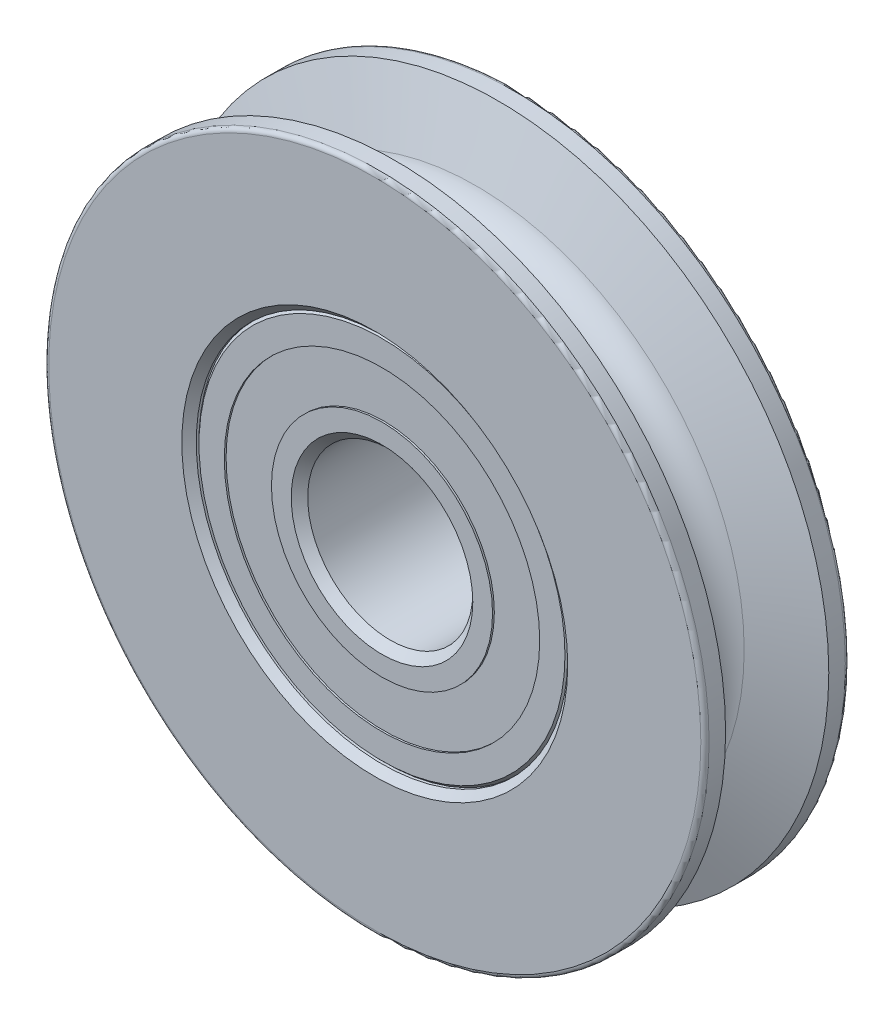
ISO-10303-21;
HEADER;
FILE_DESCRIPTION(('STEP AP214'),'2;1');
FILE_NAME('part.step','',(''),(''),'','','');
FILE_SCHEMA(('AUTOMOTIVE_DESIGN { 1 0 10303 214 1 1 1 1 }'));
ENDSEC;
DATA;
#1=APPLICATION_CONTEXT('core data for automotive mechanical design processes');
#2=APPLICATION_PROTOCOL_DEFINITION('international standard','automotive_design',2000,#1);
#3=PRODUCT_CONTEXT('',#1,'mechanical');
#4=PRODUCT('Part','Part','',(#3));
#5=PRODUCT_RELATED_PRODUCT_CATEGORY('part','',(#4));
#6=PRODUCT_DEFINITION_FORMATION('','',#4);
#7=PRODUCT_DEFINITION_CONTEXT('part definition',#1,'design');
#8=PRODUCT_DEFINITION('design','',#6,#7);
#9=PRODUCT_DEFINITION_SHAPE('','',#8);
#10=(LENGTH_UNIT() NAMED_UNIT(*) SI_UNIT(.MILLI.,.METRE.));
#11=(NAMED_UNIT(*) PLANE_ANGLE_UNIT() SI_UNIT($,.RADIAN.));
#12=(NAMED_UNIT(*) SI_UNIT($,.STERADIAN.) SOLID_ANGLE_UNIT());
#13=UNCERTAINTY_MEASURE_WITH_UNIT(LENGTH_MEASURE(1.E-05),#10,'distance_accuracy_value','');
#14=(GEOMETRIC_REPRESENTATION_CONTEXT(3) GLOBAL_UNCERTAINTY_ASSIGNED_CONTEXT((#13)) GLOBAL_UNIT_ASSIGNED_CONTEXT((#10,
#11,#12)) REPRESENTATION_CONTEXT('',''));
#15=CARTESIAN_POINT('',(0.,0.,0.));
#16=DIRECTION('',(0.,0.,1.));
#17=DIRECTION('',(1.,0.,0.));
#18=AXIS2_PLACEMENT_3D('',#15,#16,#17);
#19=CARTESIAN_POINT('',(5.57873743511983,8.68068489190182,0.));
#20=DIRECTION('',(0.,0.,1.));
#21=DIRECTION('',(0.540640817455586,0.841253532831188,0.));
#22=AXIS2_PLACEMENT_3D('',#19,#20,#21);
#23=SPHERICAL_SURFACE('',#22,2.26785714285714);
#24=CARTESIAN_POINT('',(5.57873743511983,8.68068489190182,2.26785714285714));
#25=VERTEX_POINT('',#24);
#26=VERTEX_LOOP('',#25);
#27=FACE_BOUND('',#26,.T.);
#28=ADVANCED_FACE('F46',(#27),#23,.T.);
#29=CLOSED_SHELL('',(#28));
#30=MANIFOLD_SOLID_BREP('B2',#29);
#31=CARTESIAN_POINT('',(9.38626515206438,4.28656366541333,0.));
#32=DIRECTION('',(0.,0.,1.));
#33=DIRECTION('',(0.909631995354513,0.415415013001897,0.));
#34=AXIS2_PLACEMENT_3D('',#31,#32,#33);
#35=SPHERICAL_SURFACE('',#34,2.26785714285714);
#36=CARTESIAN_POINT('',(9.38626515206438,4.28656366541333,2.26785714285714));
#37=VERTEX_POINT('',#36);
#38=VERTEX_LOOP('',#37);
#39=FACE_BOUND('',#38,.T.);
#40=ADVANCED_FACE('F65',(#39),#35,.T.);
#41=CLOSED_SHELL('',(#40));
#42=MANIFOLD_SOLID_BREP('B6',#41);
#43=CARTESIAN_POINT('',(10.2137200034089,-1.46851123743235,0.));
#44=DIRECTION('',(0.,0.,1.));
#45=DIRECTION('',(0.989821441880934,-0.142314838273275,0.));
#46=AXIS2_PLACEMENT_3D('',#43,#44,#45);
#47=SPHERICAL_SURFACE('',#46,2.26785714285714);
#48=CARTESIAN_POINT('',(10.2137200034089,-1.46851123743235,2.26785714285714));
#49=VERTEX_POINT('',#48);
#50=VERTEX_LOOP('',#49);
#51=FACE_BOUND('',#50,.T.);
#52=ADVANCED_FACE('F84',(#51),#47,.T.);
#53=CLOSED_SHELL('',(#52));
#54=MANIFOLD_SOLID_BREP('B42',#53);
#55=CARTESIAN_POINT('',(7.79839092036806,-6.75734419839784,0.));
#56=DIRECTION('',(0.,0.,1.));
#57=DIRECTION('',(0.755749574354264,-0.654860733945278,0.));
#58=AXIS2_PLACEMENT_3D('',#55,#56,#57);
#59=SPHERICAL_SURFACE('',#58,2.26785714285714);
#60=CARTESIAN_POINT('',(7.79839092036806,-6.75734419839784,2.26785714285714));
#61=VERTEX_POINT('',#60);
#62=VERTEX_LOOP('',#61);
#63=FACE_BOUND('',#62,.T.);
#64=ADVANCED_FACE('F103',(#63),#59,.T.);
#65=CLOSED_SHELL('',(#64));
#66=MANIFOLD_SOLID_BREP('B61',#65);
#67=CARTESIAN_POINT('',(2.90712782090758,-9.90076812148457,0.));
#68=DIRECTION('',(0.,0.,1.));
#69=DIRECTION('',(0.281732556841437,-0.959492973614495,0.));
#70=AXIS2_PLACEMENT_3D('',#67,#68,#69);
#71=SPHERICAL_SURFACE('',#70,2.26785714285714);
#72=CARTESIAN_POINT('',(2.90712782090758,-9.90076812148457,2.26785714285714));
#73=VERTEX_POINT('',#72);
#74=VERTEX_LOOP('',#73);
#75=FACE_BOUND('',#74,.T.);
#76=ADVANCED_FACE('F122',(#75),#71,.T.);
#77=CLOSED_SHELL('',(#76));
#78=MANIFOLD_SOLID_BREP('B80',#77);
#79=CARTESIAN_POINT('',(-2.90712782090744,-9.90076812148462,0.));
#80=DIRECTION('',(0.,0.,1.));
#81=DIRECTION('',(-0.281732556841423,-0.959492973614499,0.));
#82=AXIS2_PLACEMENT_3D('',#79,#80,#81);
#83=SPHERICAL_SURFACE('',#82,2.26785714285714);
#84=CARTESIAN_POINT('',(-2.90712782090744,-9.90076812148462,2.26785714285714));
#85=VERTEX_POINT('',#84);
#86=VERTEX_LOOP('',#85);
#87=FACE_BOUND('',#86,.T.);
#88=ADVANCED_FACE('F141',(#87),#83,.T.);
#89=CLOSED_SHELL('',(#88));
#90=MANIFOLD_SOLID_BREP('B99',#89);
#91=CARTESIAN_POINT('',(-7.79839092036797,-6.75734419839795,0.));
#92=DIRECTION('',(0.,0.,1.));
#93=DIRECTION('',(-0.755749574354255,-0.654860733945289,0.));
#94=AXIS2_PLACEMENT_3D('',#91,#92,#93);
#95=SPHERICAL_SURFACE('',#94,2.26785714285714);
#96=CARTESIAN_POINT('',(-7.79839092036797,-6.75734419839795,2.26785714285714));
#97=VERTEX_POINT('',#96);
#98=VERTEX_LOOP('',#97);
#99=FACE_BOUND('',#98,.T.);
#100=ADVANCED_FACE('F160',(#99),#95,.T.);
#101=CLOSED_SHELL('',(#100));
#102=MANIFOLD_SOLID_BREP('B118',#101);
#103=CARTESIAN_POINT('',(-10.2137200034089,-1.4685112374325,0.));
#104=DIRECTION('',(0.,0.,1.));
#105=DIRECTION('',(-0.989821441880932,-0.142314838273289,0.));
#106=AXIS2_PLACEMENT_3D('',#103,#104,#105);
#107=SPHERICAL_SURFACE('',#106,2.26785714285714);
#108=CARTESIAN_POINT('',(-10.2137200034089,-1.4685112374325,2.26785714285714));
#109=VERTEX_POINT('',#108);
#110=VERTEX_LOOP('',#109);
#111=FACE_BOUND('',#110,.T.);
#112=ADVANCED_FACE('F179',(#111),#107,.T.);
#113=CLOSED_SHELL('',(#112));
#114=MANIFOLD_SOLID_BREP('B137',#113);
#115=CARTESIAN_POINT('',(-9.38626515206445,4.28656366541319,0.));
#116=DIRECTION('',(0.,0.,1.));
#117=DIRECTION('',(-0.909631995354519,0.415415013001884,0.));
#118=AXIS2_PLACEMENT_3D('',#115,#116,#117);
#119=SPHERICAL_SURFACE('',#118,2.26785714285714);
#120=CARTESIAN_POINT('',(-9.38626515206445,4.28656366541319,2.26785714285714));
#121=VERTEX_POINT('',#120);
#122=VERTEX_LOOP('',#121);
#123=FACE_BOUND('',#122,.T.);
#124=ADVANCED_FACE('F198',(#123),#119,.T.);
#125=CLOSED_SHELL('',(#124));
#126=MANIFOLD_SOLID_BREP('B156',#125);
#127=CARTESIAN_POINT('',(-5.57873743511996,8.68068489190174,0.));
#128=DIRECTION('',(0.,0.,1.));
#129=DIRECTION('',(-0.540640817455599,0.841253532831181,0.));
#130=AXIS2_PLACEMENT_3D('',#127,#128,#129);
#131=SPHERICAL_SURFACE('',#130,2.26785714285714);
#132=CARTESIAN_POINT('',(-5.57873743511996,8.68068489190174,2.26785714285714));
#133=VERTEX_POINT('',#132);
#134=VERTEX_LOOP('',#133);
#135=FACE_BOUND('',#134,.T.);
#136=ADVANCED_FACE('F217',(#135),#131,.T.);
#137=CLOSED_SHELL('',(#136));
#138=MANIFOLD_SOLID_BREP('B175',#137);
#139=CARTESIAN_POINT('',(0.,10.31875,0.));
#140=DIRECTION('',(0.,0.,1.));
#141=DIRECTION('',(0.,1.,0.));
#142=AXIS2_PLACEMENT_3D('',#139,#140,#141);
#143=SPHERICAL_SURFACE('',#142,2.26785714285714);
#144=CARTESIAN_POINT('',(0.,10.31875,2.26785714285714));
#145=VERTEX_POINT('',#144);
#146=VERTEX_LOOP('',#145);
#147=FACE_BOUND('',#146,.T.);
#148=ADVANCED_FACE('F238',(#147),#143,.T.);
#149=CLOSED_SHELL('',(#148));
#150=MANIFOLD_SOLID_BREP('B194',#149);
#151=CARTESIAN_POINT('',(0.,0.,2.2391189590387));
#152=DIRECTION('',(0.,0.,1.));
#153=DIRECTION('',(1.,0.,0.));
#154=AXIS2_PLACEMENT_3D('',#151,#152,#153);
#155=CONICAL_SURFACE('',#154,20.6208810409613,1.22354719398162);
#156=CARTESIAN_POINT('',(0.,0.,3.96875));
#157=DIRECTION('',(0.,0.,1.));
#158=DIRECTION('',(1.,0.,0.));
#159=AXIS2_PLACEMENT_3D('',#156,#157,#158);
#160=CIRCLE('',#159,25.4);
#161=CARTESIAN_POINT('',(25.4,0.,3.96875));
#162=VERTEX_POINT('',#161);
#163=EDGE_CURVE('E237',#162,#162,#160,.T.);
#164=ORIENTED_EDGE('',*,*,#163,.F.);
#165=EDGE_LOOP('',(#164));
#166=FACE_BOUND('',#165,.T.);
#167=CARTESIAN_POINT('',(0.,0.,2.2391189590387));
#168=DIRECTION('',(0.,0.,1.));
#169=DIRECTION('',(1.,0.,0.));
#170=AXIS2_PLACEMENT_3D('',#167,#168,#169);
#171=CIRCLE('',#170,20.6208810409613);
#172=CARTESIAN_POINT('',(20.6208810409613,0.,2.2391189590387));
#173=VERTEX_POINT('',#172);
#174=EDGE_CURVE('E312',#173,#173,#171,.T.);
#175=ORIENTED_EDGE('',*,*,#174,.T.);
#176=EDGE_LOOP('',(#175));
#177=FACE_BOUND('',#176,.T.);
#178=ADVANCED_FACE('F259',(#166,#177),#155,.T.);
#179=CARTESIAN_POINT('',(0.,0.,5.000625));
#180=DIRECTION('',(0.,0.,1.));
#181=DIRECTION('',(1.,0.,0.));
#182=AXIS2_PLACEMENT_3D('',#179,#180,#181);
#183=CYLINDRICAL_SURFACE('',#182,25.4);
#184=CARTESIAN_POINT('',(0.,0.,5.23875));
#185=DIRECTION('',(0.,0.,1.));
#186=DIRECTION('',(1.,0.,0.));
#187=AXIS2_PLACEMENT_3D('',#184,#185,#186);
#188=CIRCLE('',#187,25.4);
#189=CARTESIAN_POINT('',(25.4,0.,5.23875));
#190=VERTEX_POINT('',#189);
#191=EDGE_CURVE('E266',#190,#190,#188,.T.);
#192=ORIENTED_EDGE('',*,*,#191,.F.);
#193=EDGE_LOOP('',(#192));
#194=FACE_BOUND('',#193,.T.);
#195=ORIENTED_EDGE('',*,*,#163,.T.);
#196=EDGE_LOOP('',(#195));
#197=FACE_BOUND('',#196,.T.);
#198=ADVANCED_FACE('F375',(#194,#197),#183,.T.);
#199=CARTESIAN_POINT('',(0.,0.,5.23875));
#200=DIRECTION('',(0.,0.,1.));
#201=DIRECTION('',(1.,0.,0.));
#202=AXIS2_PLACEMENT_3D('',#199,#200,#201);
#203=TOROIDAL_SURFACE('',#202,25.0825,0.317499999999999);
#204=CARTESIAN_POINT('',(0.,0.,5.55625));
#205=DIRECTION('',(0.,0.,1.));
#206=DIRECTION('',(1.,0.,0.));
#207=AXIS2_PLACEMENT_3D('',#204,#205,#206);
#208=CIRCLE('',#207,25.0825);
#209=CARTESIAN_POINT('',(25.0825,0.,5.55625));
#210=VERTEX_POINT('',#209);
#211=EDGE_CURVE('E272',#210,#210,#208,.T.);
#212=ORIENTED_EDGE('',*,*,#211,.F.);
#213=EDGE_LOOP('',(#212));
#214=FACE_BOUND('',#213,.T.);
#215=ORIENTED_EDGE('',*,*,#191,.T.);
#216=EDGE_LOOP('',(#215));
#217=FACE_BOUND('',#216,.T.);
#218=ADVANCED_FACE('F370',(#214,#217),#203,.T.);
#219=CARTESIAN_POINT('',(0.,25.0825,5.55625));
#220=DIRECTION('',(0.,0.,-1.));
#221=DIRECTION('',(-1.,0.,0.));
#222=AXIS2_PLACEMENT_3D('',#219,#220,#221);
#223=PLANE('',#222);
#224=CARTESIAN_POINT('',(0.,0.,5.55625));
#225=DIRECTION('',(0.,0.,1.));
#226=DIRECTION('',(1.,0.,0.));
#227=AXIS2_PLACEMENT_3D('',#224,#225,#226);
#228=CIRCLE('',#227,14.843125);
#229=CARTESIAN_POINT('',(14.843125,0.,5.55625));
#230=VERTEX_POINT('',#229);
#231=EDGE_CURVE('E278',#230,#230,#228,.T.);
#232=ORIENTED_EDGE('',*,*,#231,.F.);
#233=EDGE_LOOP('',(#232));
#234=FACE_BOUND('',#233,.T.);
#235=ORIENTED_EDGE('',*,*,#211,.T.);
#236=EDGE_LOOP('',(#235));
#237=FACE_BOUND('',#236,.T.);
#238=ADVANCED_FACE('F364',(#234,#237),#223,.F.);
#239=CARTESIAN_POINT('',(0.,0.,5.55625));
#240=DIRECTION('',(0.,0.,1.));
#241=DIRECTION('',(1.,0.,0.));
#242=AXIS2_PLACEMENT_3D('',#239,#240,#241);
#243=CONICAL_SURFACE('',#242,14.843125,0.78539816339745);
#244=CARTESIAN_POINT('',(0.,0.,5.000625));
#245=DIRECTION('',(0.,0.,1.));
#246=DIRECTION('',(1.,0.,0.));
#247=AXIS2_PLACEMENT_3D('',#244,#245,#246);
#248=CIRCLE('',#247,14.2875);
#249=CARTESIAN_POINT('',(14.2875,0.,5.000625));
#250=VERTEX_POINT('',#249);
#251=EDGE_CURVE('E284',#250,#250,#248,.T.);
#252=ORIENTED_EDGE('',*,*,#251,.F.);
#253=EDGE_LOOP('',(#252));
#254=FACE_BOUND('',#253,.T.);
#255=ORIENTED_EDGE('',*,*,#231,.T.);
#256=EDGE_LOOP('',(#255));
#257=FACE_BOUND('',#256,.T.);
#258=ADVANCED_FACE('F358',(#254,#257),#243,.F.);
#259=CARTESIAN_POINT('',(0.,0.,5.000625));
#260=DIRECTION('',(0.,0.,1.));
#261=DIRECTION('',(1.,0.,0.));
#262=AXIS2_PLACEMENT_3D('',#259,#260,#261);
#263=CYLINDRICAL_SURFACE('',#262,14.2875);
#264=CARTESIAN_POINT('',(0.,0.,-5.000625));
#265=DIRECTION('',(0.,0.,1.));
#266=DIRECTION('',(1.,0.,0.));
#267=AXIS2_PLACEMENT_3D('',#264,#265,#266);
#268=CIRCLE('',#267,14.2875);
#269=CARTESIAN_POINT('',(14.2875,0.,-5.000625));
#270=VERTEX_POINT('',#269);
#271=EDGE_CURVE('E288',#270,#270,#268,.T.);
#272=ORIENTED_EDGE('',*,*,#271,.F.);
#273=EDGE_LOOP('',(#272));
#274=FACE_BOUND('',#273,.T.);
#275=ORIENTED_EDGE('',*,*,#251,.T.);
#276=EDGE_LOOP('',(#275));
#277=FACE_BOUND('',#276,.T.);
#278=ADVANCED_FACE('F352',(#274,#277),#263,.F.);
#279=CARTESIAN_POINT('',(0.,0.,-5.000625));
#280=DIRECTION('',(0.,0.,-1.));
#281=DIRECTION('',(-1.,0.,0.));
#282=AXIS2_PLACEMENT_3D('',#279,#280,#281);
#283=CONICAL_SURFACE('',#282,14.2875,0.785398163397448);
#284=CARTESIAN_POINT('',(0.,0.,-5.55625));
#285=DIRECTION('',(0.,0.,1.));
#286=DIRECTION('',(1.,0.,0.));
#287=AXIS2_PLACEMENT_3D('',#284,#285,#286);
#288=CIRCLE('',#287,14.843125);
#289=CARTESIAN_POINT('',(14.843125,0.,-5.55625));
#290=VERTEX_POINT('',#289);
#291=EDGE_CURVE('E292',#290,#290,#288,.T.);
#292=ORIENTED_EDGE('',*,*,#291,.F.);
#293=EDGE_LOOP('',(#292));
#294=FACE_BOUND('',#293,.T.);
#295=ORIENTED_EDGE('',*,*,#271,.T.);
#296=EDGE_LOOP('',(#295));
#297=FACE_BOUND('',#296,.T.);
#298=ADVANCED_FACE('F346',(#294,#297),#283,.F.);
#299=CARTESIAN_POINT('',(0.,25.0825,-5.55625));
#300=DIRECTION('',(0.,0.,1.));
#301=DIRECTION('',(1.,0.,0.));
#302=AXIS2_PLACEMENT_3D('',#299,#300,#301);
#303=PLANE('',#302);
#304=CARTESIAN_POINT('',(0.,0.,-5.55625));
#305=DIRECTION('',(0.,0.,1.));
#306=DIRECTION('',(1.,0.,0.));
#307=AXIS2_PLACEMENT_3D('',#304,#305,#306);
#308=CIRCLE('',#307,25.0825);
#309=CARTESIAN_POINT('',(25.0825,0.,-5.55625));
#310=VERTEX_POINT('',#309);
#311=EDGE_CURVE('E296',#310,#310,#308,.T.);
#312=ORIENTED_EDGE('',*,*,#311,.F.);
#313=EDGE_LOOP('',(#312));
#314=FACE_BOUND('',#313,.T.);
#315=ORIENTED_EDGE('',*,*,#291,.T.);
#316=EDGE_LOOP('',(#315));
#317=FACE_BOUND('',#316,.T.);
#318=ADVANCED_FACE('F340',(#314,#317),#303,.F.);
#319=CARTESIAN_POINT('',(0.,0.,-5.23875));
#320=DIRECTION('',(0.,0.,1.));
#321=DIRECTION('',(1.,0.,0.));
#322=AXIS2_PLACEMENT_3D('',#319,#320,#321);
#323=TOROIDAL_SURFACE('',#322,25.0825,0.317499999999999);
#324=CARTESIAN_POINT('',(0.,0.,-5.23875));
#325=DIRECTION('',(0.,0.,1.));
#326=DIRECTION('',(1.,0.,0.));
#327=AXIS2_PLACEMENT_3D('',#324,#325,#326);
#328=CIRCLE('',#327,25.4);
#329=CARTESIAN_POINT('',(25.4,0.,-5.23875));
#330=VERTEX_POINT('',#329);
#331=EDGE_CURVE('E300',#330,#330,#328,.T.);
#332=ORIENTED_EDGE('',*,*,#331,.F.);
#333=EDGE_LOOP('',(#332));
#334=FACE_BOUND('',#333,.T.);
#335=ORIENTED_EDGE('',*,*,#311,.T.);
#336=EDGE_LOOP('',(#335));
#337=FACE_BOUND('',#336,.T.);
#338=ADVANCED_FACE('F334',(#334,#337),#323,.T.);
#339=CARTESIAN_POINT('',(0.,0.,5.000625));
#340=DIRECTION('',(0.,0.,1.));
#341=DIRECTION('',(1.,0.,0.));
#342=AXIS2_PLACEMENT_3D('',#339,#340,#341);
#343=CYLINDRICAL_SURFACE('',#342,25.4);
#344=CARTESIAN_POINT('',(0.,0.,-3.96875));
#345=DIRECTION('',(0.,0.,1.));
#346=DIRECTION('',(1.,0.,0.));
#347=AXIS2_PLACEMENT_3D('',#344,#345,#346);
#348=CIRCLE('',#347,25.4);
#349=CARTESIAN_POINT('',(25.4,0.,-3.96875));
#350=VERTEX_POINT('',#349);
#351=EDGE_CURVE('E304',#350,#350,#348,.T.);
#352=ORIENTED_EDGE('',*,*,#351,.F.);
#353=EDGE_LOOP('',(#352));
#354=FACE_BOUND('',#353,.T.);
#355=ORIENTED_EDGE('',*,*,#331,.T.);
#356=EDGE_LOOP('',(#355));
#357=FACE_BOUND('',#356,.T.);
#358=ADVANCED_FACE('F328',(#354,#357),#343,.T.);
#359=CARTESIAN_POINT('',(0.,0.,-3.96875));
#360=DIRECTION('',(0.,0.,-1.));
#361=DIRECTION('',(-1.,0.,0.));
#362=AXIS2_PLACEMENT_3D('',#359,#360,#361);
#363=CONICAL_SURFACE('',#362,25.4,1.22354719398162);
#364=CARTESIAN_POINT('',(0.,0.,-2.2391189590387));
#365=DIRECTION('',(0.,0.,1.));
#366=DIRECTION('',(1.,0.,0.));
#367=AXIS2_PLACEMENT_3D('',#364,#365,#366);
#368=CIRCLE('',#367,20.6208810409613);
#369=CARTESIAN_POINT('',(20.6208810409613,0.,-2.2391189590387));
#370=VERTEX_POINT('',#369);
#371=EDGE_CURVE('E308',#370,#370,#368,.T.);
#372=ORIENTED_EDGE('',*,*,#371,.F.);
#373=EDGE_LOOP('',(#372));
#374=FACE_BOUND('',#373,.T.);
#375=ORIENTED_EDGE('',*,*,#351,.T.);
#376=EDGE_LOOP('',(#375));
#377=FACE_BOUND('',#376,.T.);
#378=ADVANCED_FACE('F322',(#374,#377),#363,.T.);
#379=CARTESIAN_POINT('',(0.,0.,0.));
#380=DIRECTION('',(0.,0.,1.));
#381=DIRECTION('',(1.,0.,0.));
#382=AXIS2_PLACEMENT_3D('',#379,#380,#381);
#383=TOROIDAL_SURFACE('',#382,21.43125,2.38125);
#384=ORIENTED_EDGE('',*,*,#174,.F.);
#385=EDGE_LOOP('',(#384));
#386=FACE_BOUND('',#385,.T.);
#387=ORIENTED_EDGE('',*,*,#371,.T.);
#388=EDGE_LOOP('',(#387));
#389=FACE_BOUND('',#388,.T.);
#390=ADVANCED_FACE('F319',(#386,#389),#383,.F.);
#391=CLOSED_SHELL('',(#178,#198,#218,#238,#258,#278,#298,#318,#338,#358,#378,#390));
#392=MANIFOLD_SOLID_BREP('B213',#391);
#393=CARTESIAN_POINT('',(0.,0.,5.000625));
#394=DIRECTION('',(0.,0.,1.));
#395=DIRECTION('',(1.,0.,0.));
#396=AXIS2_PLACEMENT_3D('',#393,#394,#395);
#397=CYLINDRICAL_SURFACE('',#396,8.50446428571427);
#398=CARTESIAN_POINT('',(0.,0.,1.36071428571427));
#399=DIRECTION('',(0.,0.,1.));
#400=DIRECTION('',(1.,0.,0.));
#401=AXIS2_PLACEMENT_3D('',#398,#399,#400);
#402=CIRCLE('',#401,8.50446428571427);
#403=CARTESIAN_POINT('',(8.50446428571427,0.,1.36071428571427));
#404=VERTEX_POINT('',#403);
#405=EDGE_CURVE('E258',#404,#404,#402,.T.);
#406=ORIENTED_EDGE('',*,*,#405,.F.);
#407=EDGE_LOOP('',(#406));
#408=FACE_BOUND('',#407,.T.);
#409=CARTESIAN_POINT('',(0.,0.,4.86171875));
#410=DIRECTION('',(0.,0.,1.));
#411=DIRECTION('',(1.,0.,0.));
#412=AXIS2_PLACEMENT_3D('',#409,#410,#411);
#413=CIRCLE('',#412,8.50446428571427);
#414=CARTESIAN_POINT('',(8.50446428571427,0.,4.86171875));
#415=VERTEX_POINT('',#414);
#416=EDGE_CURVE('E492',#415,#415,#413,.T.);
#417=ORIENTED_EDGE('',*,*,#416,.T.);
#418=EDGE_LOOP('',(#417));
#419=FACE_BOUND('',#418,.T.);
#420=ADVANCED_FACE('F473',(#408,#419),#397,.F.);
#421=CARTESIAN_POINT('',(0.,0.,0.));
#422=DIRECTION('',(0.,0.,1.));
#423=DIRECTION('',(1.,0.,0.));
#424=AXIS2_PLACEMENT_3D('',#421,#422,#423);
#425=TOROIDAL_SURFACE('',#424,10.31875,2.26785714285714);
#426=CARTESIAN_POINT('',(0.,0.,1.36071428571427));
#427=DIRECTION('',(0.,0.,1.));
#428=DIRECTION('',(1.,0.,0.));
#429=AXIS2_PLACEMENT_3D('',#426,#427,#428);
#430=CIRCLE('',#429,12.1330357142857);
#431=CARTESIAN_POINT('',(12.1330357142857,0.,1.36071428571427));
#432=VERTEX_POINT('',#431);
#433=EDGE_CURVE('E480',#432,#432,#430,.T.);
#434=ORIENTED_EDGE('',*,*,#433,.F.);
#435=EDGE_LOOP('',(#434));
#436=FACE_BOUND('',#435,.T.);
#437=ORIENTED_EDGE('',*,*,#405,.T.);
#438=EDGE_LOOP('',(#437));
#439=FACE_BOUND('',#438,.T.);
#440=ADVANCED_FACE('F509',(#436,#439),#425,.F.);
#441=CARTESIAN_POINT('',(0.,0.,5.000625));
#442=DIRECTION('',(0.,0.,1.));
#443=DIRECTION('',(1.,0.,0.));
#444=AXIS2_PLACEMENT_3D('',#441,#442,#443);
#445=CYLINDRICAL_SURFACE('',#444,12.1330357142857);
#446=CARTESIAN_POINT('',(0.,0.,4.86171875));
#447=DIRECTION('',(0.,0.,1.));
#448=DIRECTION('',(1.,0.,0.));
#449=AXIS2_PLACEMENT_3D('',#446,#447,#448);
#450=CIRCLE('',#449,12.1330357142857);
#451=CARTESIAN_POINT('',(12.1330357142857,0.,4.86171875));
#452=VERTEX_POINT('',#451);
#453=EDGE_CURVE('E486',#452,#452,#450,.T.);
#454=ORIENTED_EDGE('',*,*,#453,.F.);
#455=EDGE_LOOP('',(#454));
#456=FACE_BOUND('',#455,.T.);
#457=ORIENTED_EDGE('',*,*,#433,.T.);
#458=EDGE_LOOP('',(#457));
#459=FACE_BOUND('',#458,.T.);
#460=ADVANCED_FACE('F504',(#456,#459),#445,.T.);
#461=CARTESIAN_POINT('',(0.,12.1330357142857,4.86171875));
#462=DIRECTION('',(0.,0.,-1.));
#463=DIRECTION('',(-1.,0.,0.));
#464=AXIS2_PLACEMENT_3D('',#461,#462,#463);
#465=PLANE('',#464);
#466=ORIENTED_EDGE('',*,*,#416,.F.);
#467=EDGE_LOOP('',(#466));
#468=FACE_BOUND('',#467,.T.);
#469=ORIENTED_EDGE('',*,*,#453,.T.);
#470=EDGE_LOOP('',(#469));
#471=FACE_BOUND('',#470,.T.);
#472=ADVANCED_FACE('F501',(#468,#471),#465,.F.);
#473=CLOSED_SHELL('',(#420,#440,#460,#472));
#474=MANIFOLD_SOLID_BREP('B232',#473);
#475=CARTESIAN_POINT('',(0.,0.,0.));
#476=DIRECTION('',(0.,0.,1.));
#477=DIRECTION('',(1.,0.,0.));
#478=AXIS2_PLACEMENT_3D('',#475,#476,#477);
#479=TOROIDAL_SURFACE('',#478,10.31875,2.26785714285714);
#480=CARTESIAN_POINT('',(0.,0.,-1.36071428571427));
#481=DIRECTION('',(0.,0.,1.));
#482=DIRECTION('',(1.,0.,0.));
#483=AXIS2_PLACEMENT_3D('',#480,#481,#482);
#484=CIRCLE('',#483,8.50446428571427);
#485=CARTESIAN_POINT('',(8.50446428571427,0.,-1.36071428571427));
#486=VERTEX_POINT('',#485);
#487=EDGE_CURVE('E472',#486,#486,#484,.T.);
#488=ORIENTED_EDGE('',*,*,#487,.F.);
#489=EDGE_LOOP('',(#488));
#490=FACE_BOUND('',#489,.T.);
#491=CARTESIAN_POINT('',(0.,0.,-1.36071428571427));
#492=DIRECTION('',(0.,0.,1.));
#493=DIRECTION('',(1.,0.,0.));
#494=AXIS2_PLACEMENT_3D('',#491,#492,#493);
#495=CIRCLE('',#494,12.1330357142857);
#496=CARTESIAN_POINT('',(12.1330357142857,0.,-1.36071428571427));
#497=VERTEX_POINT('',#496);
#498=EDGE_CURVE('E588',#497,#497,#495,.T.);
#499=ORIENTED_EDGE('',*,*,#498,.T.);
#500=EDGE_LOOP('',(#499));
#501=FACE_BOUND('',#500,.T.);
#502=ADVANCED_FACE('F569',(#490,#501),#479,.F.);
#503=CARTESIAN_POINT('',(0.,0.,5.000625));
#504=DIRECTION('',(0.,0.,1.));
#505=DIRECTION('',(1.,0.,0.));
#506=AXIS2_PLACEMENT_3D('',#503,#504,#505);
#507=CYLINDRICAL_SURFACE('',#506,8.50446428571427);
#508=CARTESIAN_POINT('',(0.,0.,-4.86171875));
#509=DIRECTION('',(0.,0.,1.));
#510=DIRECTION('',(1.,0.,0.));
#511=AXIS2_PLACEMENT_3D('',#508,#509,#510);
#512=CIRCLE('',#511,8.50446428571427);
#513=CARTESIAN_POINT('',(8.50446428571427,0.,-4.86171875));
#514=VERTEX_POINT('',#513);
#515=EDGE_CURVE('E576',#514,#514,#512,.T.);
#516=ORIENTED_EDGE('',*,*,#515,.F.);
#517=EDGE_LOOP('',(#516));
#518=FACE_BOUND('',#517,.T.);
#519=ORIENTED_EDGE('',*,*,#487,.T.);
#520=EDGE_LOOP('',(#519));
#521=FACE_BOUND('',#520,.T.);
#522=ADVANCED_FACE('F605',(#518,#521),#507,.F.);
#523=CARTESIAN_POINT('',(0.,8.50446428571427,-4.86171875));
#524=DIRECTION('',(0.,0.,1.));
#525=DIRECTION('',(1.,0.,0.));
#526=AXIS2_PLACEMENT_3D('',#523,#524,#525);
#527=PLANE('',#526);
#528=CARTESIAN_POINT('',(0.,0.,-4.86171875));
#529=DIRECTION('',(0.,0.,1.));
#530=DIRECTION('',(1.,0.,0.));
#531=AXIS2_PLACEMENT_3D('',#528,#529,#530);
#532=CIRCLE('',#531,12.1330357142857);
#533=CARTESIAN_POINT('',(12.1330357142857,0.,-4.86171875));
#534=VERTEX_POINT('',#533);
#535=EDGE_CURVE('E582',#534,#534,#532,.T.);
#536=ORIENTED_EDGE('',*,*,#535,.F.);
#537=EDGE_LOOP('',(#536));
#538=FACE_BOUND('',#537,.T.);
#539=ORIENTED_EDGE('',*,*,#515,.T.);
#540=EDGE_LOOP('',(#539));
#541=FACE_BOUND('',#540,.T.);
#542=ADVANCED_FACE('F600',(#538,#541),#527,.F.);
#543=CARTESIAN_POINT('',(0.,0.,5.000625));
#544=DIRECTION('',(0.,0.,1.));
#545=DIRECTION('',(1.,0.,0.));
#546=AXIS2_PLACEMENT_3D('',#543,#544,#545);
#547=CYLINDRICAL_SURFACE('',#546,12.1330357142857);
#548=ORIENTED_EDGE('',*,*,#498,.F.);
#549=EDGE_LOOP('',(#548));
#550=FACE_BOUND('',#549,.T.);
#551=ORIENTED_EDGE('',*,*,#535,.T.);
#552=EDGE_LOOP('',(#551));
#553=FACE_BOUND('',#552,.T.);
#554=ADVANCED_FACE('F597',(#550,#553),#547,.T.);
#555=CLOSED_SHELL('',(#502,#522,#542,#554));
#556=MANIFOLD_SOLID_BREP('B253',#555);
#557=CARTESIAN_POINT('',(0.,0.,-5.000625));
#558=DIRECTION('',(0.,0.,1.));
#559=DIRECTION('',(1.,0.,0.));
#560=AXIS2_PLACEMENT_3D('',#557,#558,#559);
#561=CONICAL_SURFACE('',#560,14.0758333333333,0.785398163397452);
#562=CARTESIAN_POINT('',(0.,0.,-4.78895833333334));
#563=DIRECTION('',(0.,0.,1.));
#564=DIRECTION('',(1.,0.,0.));
#565=AXIS2_PLACEMENT_3D('',#562,#563,#564);
#566=CIRCLE('',#565,14.2875);
#567=CARTESIAN_POINT('',(14.2875,0.,-4.78895833333334));
#568=VERTEX_POINT('',#567);
#569=EDGE_CURVE('E568',#568,#568,#566,.T.);
#570=ORIENTED_EDGE('',*,*,#569,.F.);
#571=EDGE_LOOP('',(#570));
#572=FACE_BOUND('',#571,.T.);
#573=CARTESIAN_POINT('',(0.,0.,-5.000625));
#574=DIRECTION('',(0.,0.,1.));
#575=DIRECTION('',(1.,0.,0.));
#576=AXIS2_PLACEMENT_3D('',#573,#574,#575);
#577=CIRCLE('',#576,14.0758333333333);
#578=CARTESIAN_POINT('',(14.0758333333333,0.,-5.000625));
#579=VERTEX_POINT('',#578);
#580=EDGE_CURVE('E701',#579,#579,#577,.T.);
#581=ORIENTED_EDGE('',*,*,#580,.T.);
#582=EDGE_LOOP('',(#581));
#583=FACE_BOUND('',#582,.T.);
#584=ADVANCED_FACE('F664',(#572,#583),#561,.T.);
#585=CARTESIAN_POINT('',(0.,0.,5.000625));
#586=DIRECTION('',(0.,0.,1.));
#587=DIRECTION('',(1.,0.,0.));
#588=AXIS2_PLACEMENT_3D('',#585,#586,#587);
#589=CYLINDRICAL_SURFACE('',#588,14.2875);
#590=CARTESIAN_POINT('',(0.,0.,4.78895833333333));
#591=DIRECTION('',(0.,0.,1.));
#592=DIRECTION('',(1.,0.,0.));
#593=AXIS2_PLACEMENT_3D('',#590,#591,#592);
#594=CIRCLE('',#593,14.2875);
#595=CARTESIAN_POINT('',(14.2875,0.,4.78895833333333));
#596=VERTEX_POINT('',#595);
#597=EDGE_CURVE('E671',#596,#596,#594,.T.);
#598=ORIENTED_EDGE('',*,*,#597,.F.);
#599=EDGE_LOOP('',(#598));
#600=FACE_BOUND('',#599,.T.);
#601=ORIENTED_EDGE('',*,*,#569,.T.);
#602=EDGE_LOOP('',(#601));
#603=FACE_BOUND('',#602,.T.);
#604=ADVANCED_FACE('F740',(#600,#603),#589,.T.);
#605=CARTESIAN_POINT('',(0.,0.,4.78895833333333));
#606=DIRECTION('',(0.,0.,-1.));
#607=DIRECTION('',(-1.,0.,0.));
#608=AXIS2_PLACEMENT_3D('',#605,#606,#607);
#609=CONICAL_SURFACE('',#608,14.2875,0.785398163397457);
#610=CARTESIAN_POINT('',(0.,0.,5.000625));
#611=DIRECTION('',(0.,0.,1.));
#612=DIRECTION('',(1.,0.,0.));
#613=AXIS2_PLACEMENT_3D('',#610,#611,#612);
#614=CIRCLE('',#613,14.0758333333333);
#615=CARTESIAN_POINT('',(14.0758333333333,0.,5.000625));
#616=VERTEX_POINT('',#615);
#617=EDGE_CURVE('E677',#616,#616,#614,.T.);
#618=ORIENTED_EDGE('',*,*,#617,.F.);
#619=EDGE_LOOP('',(#618));
#620=FACE_BOUND('',#619,.T.);
#621=ORIENTED_EDGE('',*,*,#597,.T.);
#622=EDGE_LOOP('',(#621));
#623=FACE_BOUND('',#622,.T.);
#624=ADVANCED_FACE('F735',(#620,#623),#609,.T.);
#625=CARTESIAN_POINT('',(0.,14.0758333333333,5.000625));
#626=DIRECTION('',(0.,0.,-1.));
#627=DIRECTION('',(-1.,0.,0.));
#628=AXIS2_PLACEMENT_3D('',#625,#626,#627);
#629=PLANE('',#628);
#630=CARTESIAN_POINT('',(0.,0.,5.000625));
#631=DIRECTION('',(0.,0.,1.));
#632=DIRECTION('',(1.,0.,0.));
#633=AXIS2_PLACEMENT_3D('',#630,#631,#632);
#634=CIRCLE('',#633,12.1330357142857);
#635=CARTESIAN_POINT('',(12.1330357142857,0.,5.000625));
#636=VERTEX_POINT('',#635);
#637=EDGE_CURVE('E683',#636,#636,#634,.T.);
#638=ORIENTED_EDGE('',*,*,#637,.F.);
#639=EDGE_LOOP('',(#638));
#640=FACE_BOUND('',#639,.T.);
#641=ORIENTED_EDGE('',*,*,#617,.T.);
#642=EDGE_LOOP('',(#641));
#643=FACE_BOUND('',#642,.T.);
#644=ADVANCED_FACE('F729',(#640,#643),#629,.F.);
#645=CARTESIAN_POINT('',(0.,0.,5.000625));
#646=DIRECTION('',(0.,0.,1.));
#647=DIRECTION('',(1.,0.,0.));
#648=AXIS2_PLACEMENT_3D('',#645,#646,#647);
#649=CYLINDRICAL_SURFACE('',#648,12.1330357142857);
#650=CARTESIAN_POINT('',(0.,0.,1.36071428571428));
#651=DIRECTION('',(0.,0.,1.));
#652=DIRECTION('',(1.,0.,0.));
#653=AXIS2_PLACEMENT_3D('',#650,#651,#652);
#654=CIRCLE('',#653,12.1330357142857);
#655=CARTESIAN_POINT('',(12.1330357142857,0.,1.36071428571428));
#656=VERTEX_POINT('',#655);
#657=EDGE_CURVE('E689',#656,#656,#654,.T.);
#658=ORIENTED_EDGE('',*,*,#657,.F.);
#659=EDGE_LOOP('',(#658));
#660=FACE_BOUND('',#659,.T.);
#661=ORIENTED_EDGE('',*,*,#637,.T.);
#662=EDGE_LOOP('',(#661));
#663=FACE_BOUND('',#662,.T.);
#664=ADVANCED_FACE('F723',(#660,#663),#649,.F.);
#665=CARTESIAN_POINT('',(0.,0.,0.));
#666=DIRECTION('',(0.,0.,1.));
#667=DIRECTION('',(1.,0.,0.));
#668=AXIS2_PLACEMENT_3D('',#665,#666,#667);
#669=TOROIDAL_SURFACE('',#668,10.31875,2.26785714285714);
#670=CARTESIAN_POINT('',(0.,0.,-1.36071428571428));
#671=DIRECTION('',(0.,0.,1.));
#672=DIRECTION('',(1.,0.,0.));
#673=AXIS2_PLACEMENT_3D('',#670,#671,#672);
#674=CIRCLE('',#673,12.1330357142857);
#675=CARTESIAN_POINT('',(12.1330357142857,0.,-1.36071428571428));
#676=VERTEX_POINT('',#675);
#677=EDGE_CURVE('E693',#676,#676,#674,.T.);
#678=ORIENTED_EDGE('',*,*,#677,.F.);
#679=EDGE_LOOP('',(#678));
#680=FACE_BOUND('',#679,.T.);
#681=ORIENTED_EDGE('',*,*,#657,.T.);
#682=EDGE_LOOP('',(#681));
#683=FACE_BOUND('',#682,.T.);
#684=ADVANCED_FACE('F717',(#680,#683),#669,.F.);
#685=CARTESIAN_POINT('',(0.,0.,5.000625));
#686=DIRECTION('',(0.,0.,1.));
#687=DIRECTION('',(1.,0.,0.));
#688=AXIS2_PLACEMENT_3D('',#685,#686,#687);
#689=CYLINDRICAL_SURFACE('',#688,12.1330357142857);
#690=CARTESIAN_POINT('',(0.,0.,-5.000625));
#691=DIRECTION('',(0.,0.,1.));
#692=DIRECTION('',(1.,0.,0.));
#693=AXIS2_PLACEMENT_3D('',#690,#691,#692);
#694=CIRCLE('',#693,12.1330357142857);
#695=CARTESIAN_POINT('',(12.1330357142857,0.,-5.000625));
#696=VERTEX_POINT('',#695);
#697=EDGE_CURVE('E697',#696,#696,#694,.T.);
#698=ORIENTED_EDGE('',*,*,#697,.F.);
#699=EDGE_LOOP('',(#698));
#700=FACE_BOUND('',#699,.T.);
#701=ORIENTED_EDGE('',*,*,#677,.T.);
#702=EDGE_LOOP('',(#701));
#703=FACE_BOUND('',#702,.T.);
#704=ADVANCED_FACE('F711',(#700,#703),#689,.F.);
#705=CARTESIAN_POINT('',(0.,12.1330357142857,-5.000625));
#706=DIRECTION('',(0.,0.,1.));
#707=DIRECTION('',(1.,0.,0.));
#708=AXIS2_PLACEMENT_3D('',#705,#706,#707);
#709=PLANE('',#708);
#710=ORIENTED_EDGE('',*,*,#580,.F.);
#711=EDGE_LOOP('',(#710));
#712=FACE_BOUND('',#711,.T.);
#713=ORIENTED_EDGE('',*,*,#697,.T.);
#714=EDGE_LOOP('',(#713));
#715=FACE_BOUND('',#714,.T.);
#716=ADVANCED_FACE('F708',(#712,#715),#709,.F.);
#717=CLOSED_SHELL('',(#584,#604,#624,#644,#664,#684,#704,#716));
#718=MANIFOLD_SOLID_BREP('B467',#717);
#719=CARTESIAN_POINT('',(0.,7.62,5.000625));
#720=DIRECTION('',(0.,0.,-1.));
#721=DIRECTION('',(-1.,0.,0.));
#722=AXIS2_PLACEMENT_3D('',#719,#720,#721);
#723=PLANE('',#722);
#724=CARTESIAN_POINT('',(0.,0.,5.000625));
#725=DIRECTION('',(0.,0.,1.));
#726=DIRECTION('',(1.,0.,0.));
#727=AXIS2_PLACEMENT_3D('',#724,#725,#726);
#728=CIRCLE('',#727,6.985);
#729=CARTESIAN_POINT('',(6.985,0.,5.000625));
#730=VERTEX_POINT('',#729);
#731=EDGE_CURVE('E663',#730,#730,#728,.T.);
#732=ORIENTED_EDGE('',*,*,#731,.F.);
#733=EDGE_LOOP('',(#732));
#734=FACE_BOUND('',#733,.T.);
#735=CARTESIAN_POINT('',(0.,0.,5.000625));
#736=DIRECTION('',(0.,0.,1.));
#737=DIRECTION('',(1.,0.,0.));
#738=AXIS2_PLACEMENT_3D('',#735,#736,#737);
#739=CIRCLE('',#738,8.50446428571428);
#740=CARTESIAN_POINT('',(8.50446428571428,0.,5.000625));
#741=VERTEX_POINT('',#740);
#742=EDGE_CURVE('E835',#741,#741,#739,.T.);
#743=ORIENTED_EDGE('',*,*,#742,.T.);
#744=EDGE_LOOP('',(#743));
#745=FACE_BOUND('',#744,.T.);
#746=ADVANCED_FACE('F802',(#734,#745),#723,.F.);
#747=CARTESIAN_POINT('',(0.,0.,5.000625));
#748=DIRECTION('',(0.,0.,1.));
#749=DIRECTION('',(1.,0.,0.));
#750=AXIS2_PLACEMENT_3D('',#747,#748,#749);
#751=CONICAL_SURFACE('',#750,6.985,0.785398163397448);
#752=CARTESIAN_POINT('',(0.,0.,4.365625));
#753=DIRECTION('',(0.,0.,1.));
#754=DIRECTION('',(1.,0.,0.));
#755=AXIS2_PLACEMENT_3D('',#752,#753,#754);
#756=CIRCLE('',#755,6.35);
#757=CARTESIAN_POINT('',(6.35,0.,4.365625));
#758=VERTEX_POINT('',#757);
#759=EDGE_CURVE('E809',#758,#758,#756,.T.);
#760=ORIENTED_EDGE('',*,*,#759,.F.);
#761=EDGE_LOOP('',(#760));
#762=FACE_BOUND('',#761,.T.);
#763=ORIENTED_EDGE('',*,*,#731,.T.);
#764=EDGE_LOOP('',(#763));
#765=FACE_BOUND('',#764,.T.);
#766=ADVANCED_FACE('F862',(#762,#765),#751,.F.);
#767=CARTESIAN_POINT('',(0.,0.,5.000625));
#768=DIRECTION('',(0.,0.,1.));
#769=DIRECTION('',(1.,0.,0.));
#770=AXIS2_PLACEMENT_3D('',#767,#768,#769);
#771=CYLINDRICAL_SURFACE('',#770,6.35);
#772=CARTESIAN_POINT('',(0.,0.,-4.683125));
#773=DIRECTION('',(0.,0.,1.));
#774=DIRECTION('',(1.,0.,0.));
#775=AXIS2_PLACEMENT_3D('',#772,#773,#774);
#776=CIRCLE('',#775,6.35);
#777=CARTESIAN_POINT('',(6.35,0.,-4.683125));
#778=VERTEX_POINT('',#777);
#779=EDGE_CURVE('E815',#778,#778,#776,.T.);
#780=ORIENTED_EDGE('',*,*,#779,.F.);
#781=EDGE_LOOP('',(#780));
#782=FACE_BOUND('',#781,.T.);
#783=ORIENTED_EDGE('',*,*,#759,.T.);
#784=EDGE_LOOP('',(#783));
#785=FACE_BOUND('',#784,.T.);
#786=ADVANCED_FACE('F867',(#782,#785),#771,.F.);
#787=CARTESIAN_POINT('',(0.,0.,-4.683125));
#788=DIRECTION('',(0.,0.,-1.));
#789=DIRECTION('',(-1.,0.,0.));
#790=AXIS2_PLACEMENT_3D('',#787,#788,#789);
#791=CONICAL_SURFACE('',#790,6.35,0.785398163397448);
#792=CARTESIAN_POINT('',(0.,0.,-5.000625));
#793=DIRECTION('',(0.,0.,1.));
#794=DIRECTION('',(1.,0.,0.));
#795=AXIS2_PLACEMENT_3D('',#792,#793,#794);
#796=CIRCLE('',#795,6.6675);
#797=CARTESIAN_POINT('',(6.6675,0.,-5.000625));
#798=VERTEX_POINT('',#797);
#799=EDGE_CURVE('E821',#798,#798,#796,.T.);
#800=ORIENTED_EDGE('',*,*,#799,.F.);
#801=EDGE_LOOP('',(#800));
#802=FACE_BOUND('',#801,.T.);
#803=ORIENTED_EDGE('',*,*,#779,.T.);
#804=EDGE_LOOP('',(#803));
#805=FACE_BOUND('',#804,.T.);
#806=ADVANCED_FACE('F874',(#802,#805),#791,.F.);
#807=CARTESIAN_POINT('',(0.,6.6675,-5.000625));
#808=DIRECTION('',(0.,0.,1.));
#809=DIRECTION('',(1.,0.,0.));
#810=AXIS2_PLACEMENT_3D('',#807,#808,#809);
#811=PLANE('',#810);
#812=CARTESIAN_POINT('',(0.,0.,-5.000625));
#813=DIRECTION('',(0.,0.,1.));
#814=DIRECTION('',(1.,0.,0.));
#815=AXIS2_PLACEMENT_3D('',#812,#813,#814);
#816=CIRCLE('',#815,8.50446428571428);
#817=CARTESIAN_POINT('',(8.50446428571428,0.,-5.000625));
#818=VERTEX_POINT('',#817);
#819=EDGE_CURVE('E827',#818,#818,#816,.T.);
#820=ORIENTED_EDGE('',*,*,#819,.F.);
#821=EDGE_LOOP('',(#820));
#822=FACE_BOUND('',#821,.T.);
#823=ORIENTED_EDGE('',*,*,#799,.T.);
#824=EDGE_LOOP('',(#823));
#825=FACE_BOUND('',#824,.T.);
#826=ADVANCED_FACE('F858',(#822,#825),#811,.F.);
#827=CARTESIAN_POINT('',(0.,0.,5.000625));
#828=DIRECTION('',(0.,0.,1.));
#829=DIRECTION('',(1.,0.,0.));
#830=AXIS2_PLACEMENT_3D('',#827,#828,#829);
#831=CYLINDRICAL_SURFACE('',#830,8.50446428571428);
#832=CARTESIAN_POINT('',(0.,0.,-1.36071428571428));
#833=DIRECTION('',(0.,0.,1.));
#834=DIRECTION('',(1.,0.,0.));
#835=AXIS2_PLACEMENT_3D('',#832,#833,#834);
#836=CIRCLE('',#835,8.50446428571428);
#837=CARTESIAN_POINT('',(8.50446428571428,0.,-1.36071428571428));
#838=VERTEX_POINT('',#837);
#839=EDGE_CURVE('E831',#838,#838,#836,.T.);
#840=ORIENTED_EDGE('',*,*,#839,.F.);
#841=EDGE_LOOP('',(#840));
#842=FACE_BOUND('',#841,.T.);
#843=ORIENTED_EDGE('',*,*,#819,.T.);
#844=EDGE_LOOP('',(#843));
#845=FACE_BOUND('',#844,.T.);
#846=ADVANCED_FACE('F849',(#842,#845),#831,.T.);
#847=CARTESIAN_POINT('',(0.,0.,0.));
#848=DIRECTION('',(0.,0.,1.));
#849=DIRECTION('',(1.,0.,0.));
#850=AXIS2_PLACEMENT_3D('',#847,#848,#849);
#851=TOROIDAL_SURFACE('',#850,10.31875,2.26785714285714);
#852=ORIENTED_EDGE('',*,*,#839,.T.);
#853=EDGE_LOOP('',(#852));
#854=FACE_BOUND('',#853,.T.);
#855=CARTESIAN_POINT('',(0.,0.,1.36071428571428));
#856=DIRECTION('',(0.,0.,1.));
#857=DIRECTION('',(1.,0.,0.));
#858=AXIS2_PLACEMENT_3D('',#855,#856,#857);
#859=CIRCLE('',#858,8.50446428571428);
#860=CARTESIAN_POINT('',(8.50446428571428,0.,1.36071428571428));
#861=VERTEX_POINT('',#860);
#862=EDGE_CURVE('E839',#861,#861,#859,.T.);
#863=ORIENTED_EDGE('',*,*,#862,.F.);
#864=EDGE_LOOP('',(#863));
#865=FACE_BOUND('',#864,.T.);
#866=ADVANCED_FACE('F847',(#854,#865),#851,.F.);
#867=CARTESIAN_POINT('',(0.,0.,5.000625));
#868=DIRECTION('',(0.,0.,1.));
#869=DIRECTION('',(1.,0.,0.));
#870=AXIS2_PLACEMENT_3D('',#867,#868,#869);
#871=CYLINDRICAL_SURFACE('',#870,8.50446428571428);
#872=ORIENTED_EDGE('',*,*,#742,.F.);
#873=EDGE_LOOP('',(#872));
#874=FACE_BOUND('',#873,.T.);
#875=ORIENTED_EDGE('',*,*,#862,.T.);
#876=EDGE_LOOP('',(#875));
#877=FACE_BOUND('',#876,.T.);
#878=ADVANCED_FACE('F845',(#874,#877),#871,.T.);
#879=CLOSED_SHELL('',(#746,#766,#786,#806,#826,#846,#866,#878));
#880=MANIFOLD_SOLID_BREP('B563',#879);
#881=ADVANCED_BREP_SHAPE_REPRESENTATION('',(#18,#30,#42,#54,#66,#78,#90,#102,#114,#126,#138,
#150,#392,#474,#556,#718,#880),#14);
#882=SHAPE_DEFINITION_REPRESENTATION(#9,#881);
ENDSEC;
END-ISO-10303-21;
